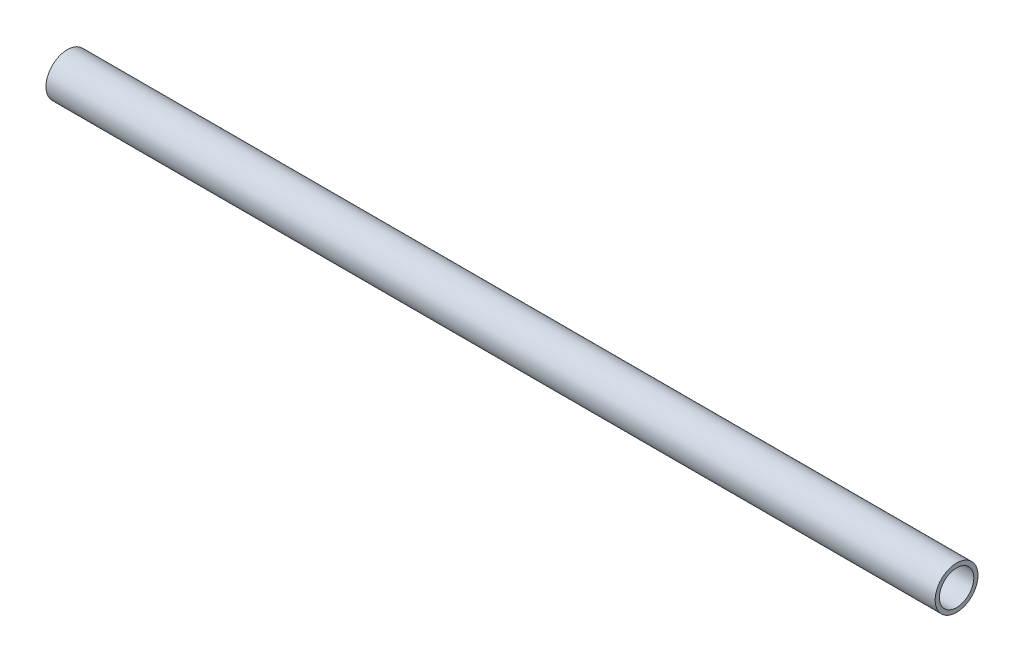
ISO-10303-21;
HEADER;
FILE_DESCRIPTION(('STEP AP214'),'2;1');
FILE_NAME('part.step','',(''),(''),'','','');
FILE_SCHEMA(('AUTOMOTIVE_DESIGN { 1 0 10303 214 1 1 1 1 }'));
ENDSEC;
DATA;
#1=APPLICATION_CONTEXT('core data for automotive mechanical design processes');
#2=APPLICATION_PROTOCOL_DEFINITION('international standard','automotive_design',2000,#1);
#3=PRODUCT_CONTEXT('',#1,'mechanical');
#4=PRODUCT('Part','Part','',(#3));
#5=PRODUCT_RELATED_PRODUCT_CATEGORY('part','',(#4));
#6=PRODUCT_DEFINITION_FORMATION('','',#4);
#7=PRODUCT_DEFINITION_CONTEXT('part definition',#1,'design');
#8=PRODUCT_DEFINITION('design','',#6,#7);
#9=PRODUCT_DEFINITION_SHAPE('','',#8);
#10=(LENGTH_UNIT() NAMED_UNIT(*) SI_UNIT(.MILLI.,.METRE.));
#11=(NAMED_UNIT(*) PLANE_ANGLE_UNIT() SI_UNIT($,.RADIAN.));
#12=(NAMED_UNIT(*) SI_UNIT($,.STERADIAN.) SOLID_ANGLE_UNIT());
#13=UNCERTAINTY_MEASURE_WITH_UNIT(LENGTH_MEASURE(1.E-05),#10,'distance_accuracy_value','');
#14=(GEOMETRIC_REPRESENTATION_CONTEXT(3) GLOBAL_UNCERTAINTY_ASSIGNED_CONTEXT((#13)) GLOBAL_UNIT_ASSIGNED_CONTEXT((#10,
#11,#12)) REPRESENTATION_CONTEXT('',''));
#15=CARTESIAN_POINT('',(0.,0.,0.));
#16=DIRECTION('',(0.,0.,1.));
#17=DIRECTION('',(1.,0.,0.));
#18=AXIS2_PLACEMENT_3D('',#15,#16,#17);
#19=CARTESIAN_POINT('',(52.95,0.,0.));
#20=DIRECTION('',(1.,0.,0.));
#21=DIRECTION('',(0.,0.,-1.));
#22=AXIS2_PLACEMENT_3D('',#19,#20,#21);
#23=PLANE('',#22);
#24=CARTESIAN_POINT('',(52.95,0.,0.));
#25=DIRECTION('',(1.,0.,0.));
#26=DIRECTION('',(0.,0.,-1.));
#27=AXIS2_PLACEMENT_3D('',#24,#25,#26);
#28=CIRCLE('',#27,2.55);
#29=CARTESIAN_POINT('',(52.95,0.,-2.55));
#30=VERTEX_POINT('',#29);
#31=EDGE_CURVE('E10',#30,#30,#28,.T.);
#32=ORIENTED_EDGE('',*,*,#31,.T.);
#33=EDGE_LOOP('',(#32));
#34=FACE_BOUND('',#33,.T.);
#35=CARTESIAN_POINT('',(52.95,0.,0.));
#36=DIRECTION('',(1.,0.,0.));
#37=DIRECTION('',(0.,0.,-1.));
#38=AXIS2_PLACEMENT_3D('',#35,#36,#37);
#39=CIRCLE('',#38,2.05);
#40=CARTESIAN_POINT('',(52.95,0.,-2.05));
#41=VERTEX_POINT('',#40);
#42=EDGE_CURVE('E50',#41,#41,#39,.T.);
#43=ORIENTED_EDGE('',*,*,#42,.F.);
#44=EDGE_LOOP('',(#43));
#45=FACE_BOUND('',#44,.T.);
#46=ADVANCED_FACE('F39',(#34,#45),#23,.T.);
#47=CARTESIAN_POINT('',(-52.95,0.,0.));
#48=DIRECTION('',(1.,0.,0.));
#49=DIRECTION('',(0.,0.,-1.));
#50=AXIS2_PLACEMENT_3D('',#47,#48,#49);
#51=PLANE('',#50);
#52=CARTESIAN_POINT('',(-52.95,0.,0.));
#53=DIRECTION('',(1.,0.,0.));
#54=DIRECTION('',(0.,0.,-1.));
#55=AXIS2_PLACEMENT_3D('',#52,#53,#54);
#56=CIRCLE('',#55,2.55);
#57=CARTESIAN_POINT('',(-52.95,0.,-2.55));
#58=VERTEX_POINT('',#57);
#59=EDGE_CURVE('E43',#58,#58,#56,.T.);
#60=ORIENTED_EDGE('',*,*,#59,.F.);
#61=EDGE_LOOP('',(#60));
#62=FACE_BOUND('',#61,.T.);
#63=CARTESIAN_POINT('',(-52.95,0.,0.));
#64=DIRECTION('',(1.,0.,0.));
#65=DIRECTION('',(0.,0.,-1.));
#66=AXIS2_PLACEMENT_3D('',#63,#64,#65);
#67=CIRCLE('',#66,2.05);
#68=CARTESIAN_POINT('',(-52.95,0.,-2.05));
#69=VERTEX_POINT('',#68);
#70=EDGE_CURVE('E52',#69,#69,#67,.T.);
#71=ORIENTED_EDGE('',*,*,#70,.T.);
#72=EDGE_LOOP('',(#71));
#73=FACE_BOUND('',#72,.T.);
#74=ADVANCED_FACE('F62',(#62,#73),#51,.F.);
#75=CARTESIAN_POINT('',(52.95,0.,0.));
#76=DIRECTION('',(-1.,0.,0.));
#77=DIRECTION('',(0.,0.,1.));
#78=AXIS2_PLACEMENT_3D('',#75,#76,#77);
#79=CYLINDRICAL_SURFACE('',#78,2.55);
#80=ORIENTED_EDGE('',*,*,#31,.F.);
#81=EDGE_LOOP('',(#80));
#82=FACE_BOUND('',#81,.T.);
#83=ORIENTED_EDGE('',*,*,#59,.T.);
#84=EDGE_LOOP('',(#83));
#85=FACE_BOUND('',#84,.T.);
#86=ADVANCED_FACE('F41',(#82,#85),#79,.T.);
#87=CARTESIAN_POINT('',(52.95,0.,0.));
#88=DIRECTION('',(-1.,0.,0.));
#89=DIRECTION('',(0.,0.,1.));
#90=AXIS2_PLACEMENT_3D('',#87,#88,#89);
#91=CYLINDRICAL_SURFACE('',#90,2.05);
#92=ORIENTED_EDGE('',*,*,#42,.T.);
#93=EDGE_LOOP('',(#92));
#94=FACE_BOUND('',#93,.T.);
#95=ORIENTED_EDGE('',*,*,#70,.F.);
#96=EDGE_LOOP('',(#95));
#97=FACE_BOUND('',#96,.T.);
#98=ADVANCED_FACE('F58',(#94,#97),#91,.F.);
#99=CLOSED_SHELL('',(#46,#74,#86,#98));
#100=MANIFOLD_SOLID_BREP('B2',#99);
#101=ADVANCED_BREP_SHAPE_REPRESENTATION('',(#18,#100),#14);
#102=SHAPE_DEFINITION_REPRESENTATION(#9,#101);
ENDSEC;
END-ISO-10303-21;
